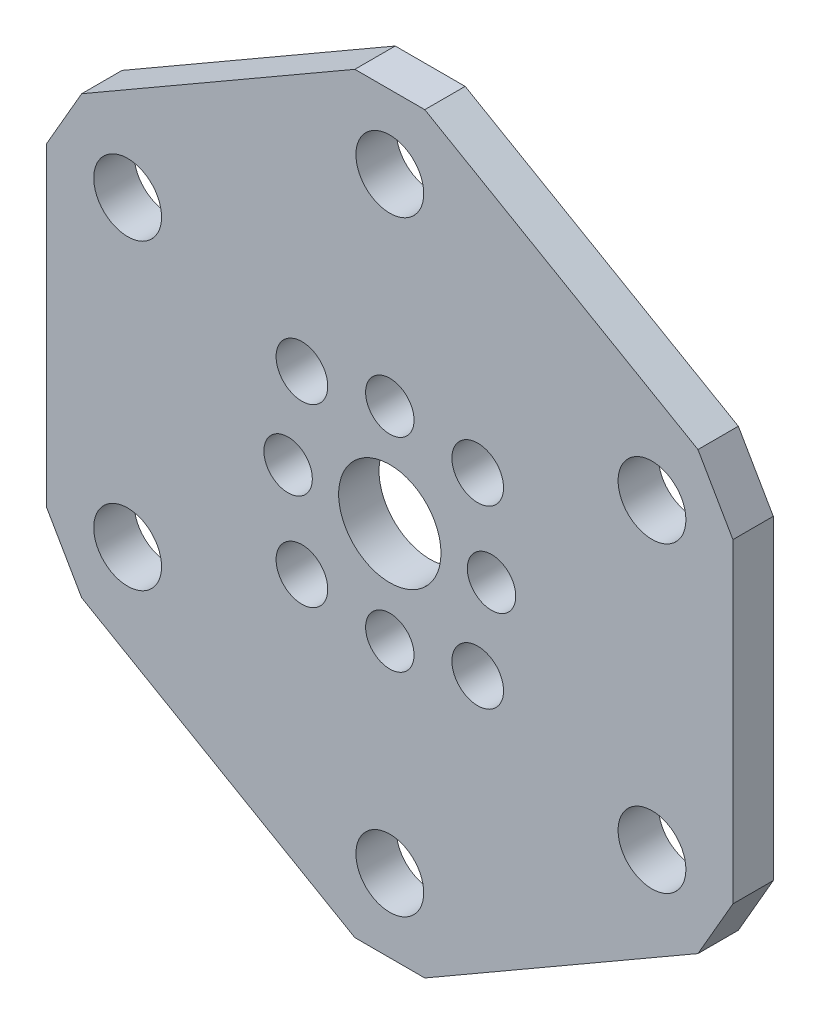
ISO-10303-21;
HEADER;
FILE_DESCRIPTION(('STEP AP214'),'2;1');
FILE_NAME('part.step','',(''),(''),'','','');
FILE_SCHEMA(('AUTOMOTIVE_DESIGN { 1 0 10303 214 1 1 1 1 }'));
ENDSEC;
DATA;
#1=APPLICATION_CONTEXT('core data for automotive mechanical design processes');
#2=APPLICATION_PROTOCOL_DEFINITION('international standard','automotive_design',2000,#1);
#3=PRODUCT_CONTEXT('',#1,'mechanical');
#4=PRODUCT('Part','Part','',(#3));
#5=PRODUCT_RELATED_PRODUCT_CATEGORY('part','',(#4));
#6=PRODUCT_DEFINITION_FORMATION('','',#4);
#7=PRODUCT_DEFINITION_CONTEXT('part definition',#1,'design');
#8=PRODUCT_DEFINITION('design','',#6,#7);
#9=PRODUCT_DEFINITION_SHAPE('','',#8);
#10=(LENGTH_UNIT() NAMED_UNIT(*) SI_UNIT(.MILLI.,.METRE.));
#11=(NAMED_UNIT(*) PLANE_ANGLE_UNIT() SI_UNIT($,.RADIAN.));
#12=(NAMED_UNIT(*) SI_UNIT($,.STERADIAN.) SOLID_ANGLE_UNIT());
#13=UNCERTAINTY_MEASURE_WITH_UNIT(LENGTH_MEASURE(1.E-05),#10,'distance_accuracy_value','');
#14=(GEOMETRIC_REPRESENTATION_CONTEXT(3) GLOBAL_UNCERTAINTY_ASSIGNED_CONTEXT((#13)) GLOBAL_UNIT_ASSIGNED_CONTEXT((#10,
#11,#12)) REPRESENTATION_CONTEXT('',''));
#15=CARTESIAN_POINT('',(0.,0.,0.));
#16=DIRECTION('',(0.,0.,1.));
#17=DIRECTION('',(1.,0.,0.));
#18=AXIS2_PLACEMENT_3D('',#15,#16,#17);
#19=CARTESIAN_POINT('',(-24.2378693429844,17.168740389755,3.175));
#20=DIRECTION('',(-0.5,0.866025403784439,0.));
#21=DIRECTION('',(-0.866025403784439,-0.5,0.));
#22=AXIS2_PLACEMENT_3D('',#19,#20,#21);
#23=PLANE('',#22);
#24=DIRECTION('',(0.866025403784439,0.5,0.));
#25=VECTOR('',#24,1.);
#26=CARTESIAN_POINT('',(-24.2378693429844,17.168740389755,0.));
#27=LINE('',#26,#25);
#28=CARTESIAN_POINT('',(-24.2378693429844,17.168740389755,0.));
#29=VERTEX_POINT('',#28);
#30=CARTESIAN_POINT('',(-2.74963065701559,29.5749807795101,0.));
#31=VERTEX_POINT('',#30);
#32=EDGE_CURVE('E154',#29,#31,#27,.T.);
#33=ORIENTED_EDGE('',*,*,#32,.F.);
#34=DIRECTION('',(0.,0.,-1.));
#35=VECTOR('',#34,1.);
#36=CARTESIAN_POINT('',(-24.2378693429844,17.168740389755,3.175));
#37=LINE('',#36,#35);
#38=CARTESIAN_POINT('',(-24.2378693429844,17.168740389755,3.175));
#39=VERTEX_POINT('',#38);
#40=EDGE_CURVE('E11',#39,#29,#37,.T.);
#41=ORIENTED_EDGE('',*,*,#40,.F.);
#42=DIRECTION('',(0.866025403784439,0.5,0.));
#43=VECTOR('',#42,1.);
#44=CARTESIAN_POINT('',(-24.2378693429844,17.168740389755,3.175));
#45=LINE('',#44,#43);
#46=CARTESIAN_POINT('',(-2.74963065701559,29.5749807795101,3.175));
#47=VERTEX_POINT('',#46);
#48=EDGE_CURVE('E187',#39,#47,#45,.T.);
#49=ORIENTED_EDGE('',*,*,#48,.T.);
#50=DIRECTION('',(0.,0.,-1.));
#51=VECTOR('',#50,1.);
#52=CARTESIAN_POINT('',(-2.74963065701559,29.5749807795101,3.175));
#53=LINE('',#52,#51);
#54=EDGE_CURVE('E36',#47,#31,#53,.T.);
#55=ORIENTED_EDGE('',*,*,#54,.T.);
#56=EDGE_LOOP('',(#33,#41,#49,#55));
#57=FACE_BOUND('',#56,.T.);
#58=ADVANCED_FACE('F33',(#57),#23,.T.);
#59=CARTESIAN_POINT('',(-26.9875,12.406240389755,3.175));
#60=DIRECTION('',(-0.866025403784438,0.5,0.));
#61=DIRECTION('',(-0.5,-0.866025403784439,0.));
#62=AXIS2_PLACEMENT_3D('',#59,#60,#61);
#63=PLANE('',#62);
#64=DIRECTION('',(0.5,0.866025403784439,0.));
#65=VECTOR('',#64,1.);
#66=CARTESIAN_POINT('',(-26.9875,12.406240389755,0.));
#67=LINE('',#66,#65);
#68=CARTESIAN_POINT('',(-26.9875,12.406240389755,0.));
#69=VERTEX_POINT('',#68);
#70=EDGE_CURVE('E185',#69,#29,#67,.T.);
#71=ORIENTED_EDGE('',*,*,#70,.F.);
#72=DIRECTION('',(0.,0.,-1.));
#73=VECTOR('',#72,1.);
#74=CARTESIAN_POINT('',(-26.9875,12.406240389755,3.175));
#75=LINE('',#74,#73);
#76=CARTESIAN_POINT('',(-26.9875,12.406240389755,3.175));
#77=VERTEX_POINT('',#76);
#78=EDGE_CURVE('E42',#77,#69,#75,.T.);
#79=ORIENTED_EDGE('',*,*,#78,.F.);
#80=DIRECTION('',(0.5,0.866025403784439,0.));
#81=VECTOR('',#80,1.);
#82=CARTESIAN_POINT('',(-26.9875,12.406240389755,3.175));
#83=LINE('',#82,#81);
#84=EDGE_CURVE('E144',#77,#39,#83,.T.);
#85=ORIENTED_EDGE('',*,*,#84,.T.);
#86=ORIENTED_EDGE('',*,*,#40,.T.);
#87=EDGE_LOOP('',(#71,#79,#85,#86));
#88=FACE_BOUND('',#87,.T.);
#89=ADVANCED_FACE('F207',(#88),#63,.T.);
#90=CARTESIAN_POINT('',(-26.9875,-12.406240389755,3.175));
#91=DIRECTION('',(-1.,0.,0.));
#92=DIRECTION('',(0.,-1.,0.));
#93=AXIS2_PLACEMENT_3D('',#90,#91,#92);
#94=PLANE('',#93);
#95=DIRECTION('',(0.,1.,0.));
#96=VECTOR('',#95,1.);
#97=CARTESIAN_POINT('',(-26.9875,-12.406240389755,0.));
#98=LINE('',#97,#96);
#99=CARTESIAN_POINT('',(-26.9875,-12.406240389755,0.));
#100=VERTEX_POINT('',#99);
#101=EDGE_CURVE('E131',#100,#69,#98,.T.);
#102=ORIENTED_EDGE('',*,*,#101,.F.);
#103=DIRECTION('',(0.,0.,-1.));
#104=VECTOR('',#103,1.);
#105=CARTESIAN_POINT('',(-26.9875,-12.406240389755,3.175));
#106=LINE('',#105,#104);
#107=CARTESIAN_POINT('',(-26.9875,-12.406240389755,3.175));
#108=VERTEX_POINT('',#107);
#109=EDGE_CURVE('E126',#108,#100,#106,.T.);
#110=ORIENTED_EDGE('',*,*,#109,.F.);
#111=DIRECTION('',(0.,1.,0.));
#112=VECTOR('',#111,1.);
#113=CARTESIAN_POINT('',(-26.9875,-12.406240389755,3.175));
#114=LINE('',#113,#112);
#115=EDGE_CURVE('E129',#108,#77,#114,.T.);
#116=ORIENTED_EDGE('',*,*,#115,.T.);
#117=ORIENTED_EDGE('',*,*,#78,.T.);
#118=EDGE_LOOP('',(#102,#110,#116,#117));
#119=FACE_BOUND('',#118,.T.);
#120=ADVANCED_FACE('F128',(#119),#94,.T.);
#121=CARTESIAN_POINT('',(-24.2378693429844,-17.168740389755,3.175));
#122=DIRECTION('',(-0.866025403784439,-0.5,0.));
#123=DIRECTION('',(0.5,-0.866025403784439,0.));
#124=AXIS2_PLACEMENT_3D('',#121,#122,#123);
#125=PLANE('',#124);
#126=DIRECTION('',(-0.5,0.866025403784439,0.));
#127=VECTOR('',#126,1.);
#128=CARTESIAN_POINT('',(-24.2378693429844,-17.168740389755,0.));
#129=LINE('',#128,#127);
#130=CARTESIAN_POINT('',(-24.2378693429844,-17.168740389755,0.));
#131=VERTEX_POINT('',#130);
#132=EDGE_CURVE('E182',#131,#100,#129,.T.);
#133=ORIENTED_EDGE('',*,*,#132,.F.);
#134=DIRECTION('',(0.,0.,-1.));
#135=VECTOR('',#134,1.);
#136=CARTESIAN_POINT('',(-24.2378693429844,-17.168740389755,3.175));
#137=LINE('',#136,#135);
#138=CARTESIAN_POINT('',(-24.2378693429844,-17.168740389755,3.175));
#139=VERTEX_POINT('',#138);
#140=EDGE_CURVE('E136',#139,#131,#137,.T.);
#141=ORIENTED_EDGE('',*,*,#140,.F.);
#142=DIRECTION('',(-0.5,0.866025403784439,0.));
#143=VECTOR('',#142,1.);
#144=CARTESIAN_POINT('',(-24.2378693429844,-17.168740389755,3.175));
#145=LINE('',#144,#143);
#146=EDGE_CURVE('E142',#139,#108,#145,.T.);
#147=ORIENTED_EDGE('',*,*,#146,.T.);
#148=ORIENTED_EDGE('',*,*,#109,.T.);
#149=EDGE_LOOP('',(#133,#141,#147,#148));
#150=FACE_BOUND('',#149,.T.);
#151=ADVANCED_FACE('F146',(#150),#125,.T.);
#152=CARTESIAN_POINT('',(-2.7496306570156,-29.57498077951,3.175));
#153=DIRECTION('',(-0.5,-0.866025403784439,0.));
#154=DIRECTION('',(0.866025403784439,-0.5,0.));
#155=AXIS2_PLACEMENT_3D('',#152,#153,#154);
#156=PLANE('',#155);
#157=DIRECTION('',(-0.866025403784438,0.5,0.));
#158=VECTOR('',#157,1.);
#159=CARTESIAN_POINT('',(-2.7496306570156,-29.57498077951,0.));
#160=LINE('',#159,#158);
#161=CARTESIAN_POINT('',(-2.7496306570156,-29.57498077951,0.));
#162=VERTEX_POINT('',#161);
#163=EDGE_CURVE('E179',#162,#131,#160,.T.);
#164=ORIENTED_EDGE('',*,*,#163,.F.);
#165=DIRECTION('',(0.,0.,-1.));
#166=VECTOR('',#165,1.);
#167=CARTESIAN_POINT('',(-2.7496306570156,-29.57498077951,3.175));
#168=LINE('',#167,#166);
#169=CARTESIAN_POINT('',(-2.7496306570156,-29.57498077951,3.175));
#170=VERTEX_POINT('',#169);
#171=EDGE_CURVE('E191',#170,#162,#168,.T.);
#172=ORIENTED_EDGE('',*,*,#171,.F.);
#173=DIRECTION('',(-0.866025403784438,0.5,0.));
#174=VECTOR('',#173,1.);
#175=CARTESIAN_POINT('',(-2.7496306570156,-29.57498077951,3.175));
#176=LINE('',#175,#174);
#177=EDGE_CURVE('E147',#170,#139,#176,.T.);
#178=ORIENTED_EDGE('',*,*,#177,.T.);
#179=ORIENTED_EDGE('',*,*,#140,.T.);
#180=EDGE_LOOP('',(#164,#172,#178,#179));
#181=FACE_BOUND('',#180,.T.);
#182=ADVANCED_FACE('F220',(#181),#156,.T.);
#183=CARTESIAN_POINT('',(2.74963065701558,-29.57498077951,3.175));
#184=DIRECTION('',(0.,-1.,0.));
#185=DIRECTION('',(0.,0.,-1.));
#186=AXIS2_PLACEMENT_3D('',#183,#184,#185);
#187=PLANE('',#186);
#188=DIRECTION('',(-1.,0.,0.));
#189=VECTOR('',#188,1.);
#190=CARTESIAN_POINT('',(2.74963065701558,-29.57498077951,0.));
#191=LINE('',#190,#189);
#192=CARTESIAN_POINT('',(2.74963065701558,-29.57498077951,0.));
#193=VERTEX_POINT('',#192);
#194=EDGE_CURVE('E176',#193,#162,#191,.T.);
#195=ORIENTED_EDGE('',*,*,#194,.F.);
#196=DIRECTION('',(0.,0.,-1.));
#197=VECTOR('',#196,1.);
#198=CARTESIAN_POINT('',(2.74963065701558,-29.57498077951,3.175));
#199=LINE('',#198,#197);
#200=CARTESIAN_POINT('',(2.74963065701558,-29.57498077951,3.175));
#201=VERTEX_POINT('',#200);
#202=EDGE_CURVE('E193',#201,#193,#199,.T.);
#203=ORIENTED_EDGE('',*,*,#202,.F.);
#204=DIRECTION('',(-1.,0.,0.));
#205=VECTOR('',#204,1.);
#206=CARTESIAN_POINT('',(2.74963065701558,-29.57498077951,3.175));
#207=LINE('',#206,#205);
#208=EDGE_CURVE('E149',#201,#170,#207,.T.);
#209=ORIENTED_EDGE('',*,*,#208,.T.);
#210=ORIENTED_EDGE('',*,*,#171,.T.);
#211=EDGE_LOOP('',(#195,#203,#209,#210));
#212=FACE_BOUND('',#211,.T.);
#213=ADVANCED_FACE('F223',(#212),#187,.T.);
#214=CARTESIAN_POINT('',(24.2378693429844,-17.168740389755,3.175));
#215=DIRECTION('',(0.5,-0.866025403784439,0.));
#216=DIRECTION('',(0.866025403784439,0.5,0.));
#217=AXIS2_PLACEMENT_3D('',#214,#215,#216);
#218=PLANE('',#217);
#219=DIRECTION('',(-0.866025403784439,-0.5,0.));
#220=VECTOR('',#219,1.);
#221=CARTESIAN_POINT('',(24.2378693429844,-17.168740389755,0.));
#222=LINE('',#221,#220);
#223=CARTESIAN_POINT('',(24.2378693429844,-17.168740389755,0.));
#224=VERTEX_POINT('',#223);
#225=EDGE_CURVE('E173',#224,#193,#222,.T.);
#226=ORIENTED_EDGE('',*,*,#225,.F.);
#227=DIRECTION('',(0.,0.,-1.));
#228=VECTOR('',#227,1.);
#229=CARTESIAN_POINT('',(24.2378693429844,-17.168740389755,3.175));
#230=LINE('',#229,#228);
#231=CARTESIAN_POINT('',(24.2378693429844,-17.168740389755,3.175));
#232=VERTEX_POINT('',#231);
#233=EDGE_CURVE('E195',#232,#224,#230,.T.);
#234=ORIENTED_EDGE('',*,*,#233,.F.);
#235=DIRECTION('',(-0.866025403784439,-0.5,0.));
#236=VECTOR('',#235,1.);
#237=CARTESIAN_POINT('',(24.2378693429844,-17.168740389755,3.175));
#238=LINE('',#237,#236);
#239=EDGE_CURVE('E427',#232,#201,#238,.T.);
#240=ORIENTED_EDGE('',*,*,#239,.T.);
#241=ORIENTED_EDGE('',*,*,#202,.T.);
#242=EDGE_LOOP('',(#226,#234,#240,#241));
#243=FACE_BOUND('',#242,.T.);
#244=ADVANCED_FACE('F227',(#243),#218,.T.);
#245=CARTESIAN_POINT('',(26.9875,-12.406240389755,3.175));
#246=DIRECTION('',(0.866025403784438,-0.5,0.));
#247=DIRECTION('',(0.5,0.866025403784439,0.));
#248=AXIS2_PLACEMENT_3D('',#245,#246,#247);
#249=PLANE('',#248);
#250=DIRECTION('',(-0.5,-0.866025403784438,0.));
#251=VECTOR('',#250,1.);
#252=CARTESIAN_POINT('',(26.9875,-12.406240389755,0.));
#253=LINE('',#252,#251);
#254=CARTESIAN_POINT('',(26.9875,-12.406240389755,0.));
#255=VERTEX_POINT('',#254);
#256=EDGE_CURVE('E170',#255,#224,#253,.T.);
#257=ORIENTED_EDGE('',*,*,#256,.F.);
#258=DIRECTION('',(0.,0.,-1.));
#259=VECTOR('',#258,1.);
#260=CARTESIAN_POINT('',(26.9875,-12.406240389755,3.175));
#261=LINE('',#260,#259);
#262=CARTESIAN_POINT('',(26.9875,-12.406240389755,3.175));
#263=VERTEX_POINT('',#262);
#264=EDGE_CURVE('E197',#263,#255,#261,.T.);
#265=ORIENTED_EDGE('',*,*,#264,.F.);
#266=DIRECTION('',(-0.5,-0.866025403784438,0.));
#267=VECTOR('',#266,1.);
#268=CARTESIAN_POINT('',(26.9875,-12.406240389755,3.175));
#269=LINE('',#268,#267);
#270=EDGE_CURVE('E424',#263,#232,#269,.T.);
#271=ORIENTED_EDGE('',*,*,#270,.T.);
#272=ORIENTED_EDGE('',*,*,#233,.T.);
#273=EDGE_LOOP('',(#257,#265,#271,#272));
#274=FACE_BOUND('',#273,.T.);
#275=ADVANCED_FACE('F231',(#274),#249,.T.);
#276=CARTESIAN_POINT('',(26.9875,12.406240389755,3.175));
#277=DIRECTION('',(1.,0.,0.));
#278=DIRECTION('',(0.,1.,0.));
#279=AXIS2_PLACEMENT_3D('',#276,#277,#278);
#280=PLANE('',#279);
#281=DIRECTION('',(0.,-1.,0.));
#282=VECTOR('',#281,1.);
#283=CARTESIAN_POINT('',(26.9875,12.406240389755,0.));
#284=LINE('',#283,#282);
#285=CARTESIAN_POINT('',(26.9875,12.406240389755,0.));
#286=VERTEX_POINT('',#285);
#287=EDGE_CURVE('E167',#286,#255,#284,.T.);
#288=ORIENTED_EDGE('',*,*,#287,.F.);
#289=DIRECTION('',(0.,0.,-1.));
#290=VECTOR('',#289,1.);
#291=CARTESIAN_POINT('',(26.9875,12.406240389755,3.175));
#292=LINE('',#291,#290);
#293=CARTESIAN_POINT('',(26.9875,12.406240389755,3.175));
#294=VERTEX_POINT('',#293);
#295=EDGE_CURVE('E199',#294,#286,#292,.T.);
#296=ORIENTED_EDGE('',*,*,#295,.F.);
#297=DIRECTION('',(0.,-1.,0.));
#298=VECTOR('',#297,1.);
#299=CARTESIAN_POINT('',(26.9875,12.406240389755,3.175));
#300=LINE('',#299,#298);
#301=EDGE_CURVE('E421',#294,#263,#300,.T.);
#302=ORIENTED_EDGE('',*,*,#301,.T.);
#303=ORIENTED_EDGE('',*,*,#264,.T.);
#304=EDGE_LOOP('',(#288,#296,#302,#303));
#305=FACE_BOUND('',#304,.T.);
#306=ADVANCED_FACE('F235',(#305),#280,.T.);
#307=CARTESIAN_POINT('',(24.2378693429844,17.168740389755,3.175));
#308=DIRECTION('',(0.866025403784439,0.5,0.));
#309=DIRECTION('',(-0.5,0.866025403784439,0.));
#310=AXIS2_PLACEMENT_3D('',#307,#308,#309);
#311=PLANE('',#310);
#312=DIRECTION('',(0.5,-0.866025403784439,0.));
#313=VECTOR('',#312,1.);
#314=CARTESIAN_POINT('',(24.2378693429844,17.168740389755,0.));
#315=LINE('',#314,#313);
#316=CARTESIAN_POINT('',(24.2378693429844,17.168740389755,0.));
#317=VERTEX_POINT('',#316);
#318=EDGE_CURVE('E164',#317,#286,#315,.T.);
#319=ORIENTED_EDGE('',*,*,#318,.F.);
#320=DIRECTION('',(0.,0.,-1.));
#321=VECTOR('',#320,1.);
#322=CARTESIAN_POINT('',(24.2378693429844,17.168740389755,3.175));
#323=LINE('',#322,#321);
#324=CARTESIAN_POINT('',(24.2378693429844,17.168740389755,3.175));
#325=VERTEX_POINT('',#324);
#326=EDGE_CURVE('E201',#325,#317,#323,.T.);
#327=ORIENTED_EDGE('',*,*,#326,.F.);
#328=DIRECTION('',(0.5,-0.866025403784439,0.));
#329=VECTOR('',#328,1.);
#330=CARTESIAN_POINT('',(24.2378693429844,17.168740389755,3.175));
#331=LINE('',#330,#329);
#332=EDGE_CURVE('E418',#325,#294,#331,.T.);
#333=ORIENTED_EDGE('',*,*,#332,.T.);
#334=ORIENTED_EDGE('',*,*,#295,.T.);
#335=EDGE_LOOP('',(#319,#327,#333,#334));
#336=FACE_BOUND('',#335,.T.);
#337=ADVANCED_FACE('F239',(#336),#311,.T.);
#338=CARTESIAN_POINT('',(2.74963065701559,29.5749807795101,3.175));
#339=DIRECTION('',(0.5,0.866025403784438,0.));
#340=DIRECTION('',(-0.866025403784439,0.5,0.));
#341=AXIS2_PLACEMENT_3D('',#338,#339,#340);
#342=PLANE('',#341);
#343=DIRECTION('',(0.866025403784438,-0.5,0.));
#344=VECTOR('',#343,1.);
#345=CARTESIAN_POINT('',(2.74963065701559,29.5749807795101,0.));
#346=LINE('',#345,#344);
#347=CARTESIAN_POINT('',(2.74963065701559,29.5749807795101,0.));
#348=VERTEX_POINT('',#347);
#349=EDGE_CURVE('E161',#348,#317,#346,.T.);
#350=ORIENTED_EDGE('',*,*,#349,.F.);
#351=DIRECTION('',(0.,0.,-1.));
#352=VECTOR('',#351,1.);
#353=CARTESIAN_POINT('',(2.74963065701559,29.5749807795101,3.175));
#354=LINE('',#353,#352);
#355=CARTESIAN_POINT('',(2.74963065701559,29.5749807795101,3.175));
#356=VERTEX_POINT('',#355);
#357=EDGE_CURVE('E202',#356,#348,#354,.T.);
#358=ORIENTED_EDGE('',*,*,#357,.F.);
#359=DIRECTION('',(0.866025403784438,-0.5,0.));
#360=VECTOR('',#359,1.);
#361=CARTESIAN_POINT('',(2.74963065701559,29.5749807795101,3.175));
#362=LINE('',#361,#360);
#363=EDGE_CURVE('E415',#356,#325,#362,.T.);
#364=ORIENTED_EDGE('',*,*,#363,.T.);
#365=ORIENTED_EDGE('',*,*,#326,.T.);
#366=EDGE_LOOP('',(#350,#358,#364,#365));
#367=FACE_BOUND('',#366,.T.);
#368=ADVANCED_FACE('F243',(#367),#342,.T.);
#369=CARTESIAN_POINT('',(-2.74963065701559,29.5749807795101,3.175));
#370=DIRECTION('',(0.,1.,0.));
#371=DIRECTION('',(0.,0.,1.));
#372=AXIS2_PLACEMENT_3D('',#369,#370,#371);
#373=PLANE('',#372);
#374=DIRECTION('',(1.,0.,0.));
#375=VECTOR('',#374,1.);
#376=CARTESIAN_POINT('',(-2.74963065701559,29.5749807795101,0.));
#377=LINE('',#376,#375);
#378=EDGE_CURVE('E157',#31,#348,#377,.T.);
#379=ORIENTED_EDGE('',*,*,#378,.F.);
#380=ORIENTED_EDGE('',*,*,#54,.F.);
#381=DIRECTION('',(1.,0.,0.));
#382=VECTOR('',#381,1.);
#383=CARTESIAN_POINT('',(-2.74963065701559,29.5749807795101,3.175));
#384=LINE('',#383,#382);
#385=EDGE_CURVE('E413',#47,#356,#384,.T.);
#386=ORIENTED_EDGE('',*,*,#385,.T.);
#387=ORIENTED_EDGE('',*,*,#357,.T.);
#388=EDGE_LOOP('',(#379,#380,#386,#387));
#389=FACE_BOUND('',#388,.T.);
#390=ADVANCED_FACE('F204',(#389),#373,.T.);
#391=CARTESIAN_POINT('',(0.,0.,3.175));
#392=DIRECTION('',(0.,0.,-1.));
#393=DIRECTION('',(-1.,0.,0.));
#394=AXIS2_PLACEMENT_3D('',#391,#392,#393);
#395=PLANE('',#394);
#396=CARTESIAN_POINT('',(-6.91479721322323,6.91479721322326,3.175));
#397=DIRECTION('',(0.,0.,-1.));
#398=DIRECTION('',(1.,0.,0.));
#399=AXIS2_PLACEMENT_3D('',#396,#397,#398);
#400=CIRCLE('',#399,2.03200000000004);
#401=CARTESIAN_POINT('',(-4.88279721322319,6.91479721322326,3.175));
#402=VERTEX_POINT('',#401);
#403=EDGE_CURVE('E322',#402,#402,#400,.T.);
#404=ORIENTED_EDGE('',*,*,#403,.T.);
#405=EDGE_LOOP('',(#404));
#406=FACE_BOUND('',#405,.T.);
#407=CARTESIAN_POINT('',(-6.91479721322326,-6.91479721322323,3.175));
#408=DIRECTION('',(0.,0.,-1.));
#409=DIRECTION('',(1.,0.,0.));
#410=AXIS2_PLACEMENT_3D('',#407,#408,#409);
#411=CIRCLE('',#410,2.03200000000003);
#412=CARTESIAN_POINT('',(-4.88279721322323,-6.91479721322323,3.175));
#413=VERTEX_POINT('',#412);
#414=EDGE_CURVE('E330',#413,#413,#411,.T.);
#415=ORIENTED_EDGE('',*,*,#414,.T.);
#416=EDGE_LOOP('',(#415));
#417=FACE_BOUND('',#416,.T.);
#418=CARTESIAN_POINT('',(6.91479721322321,-6.91479721322328,3.175));
#419=DIRECTION('',(0.,0.,-1.));
#420=DIRECTION('',(1.,0.,0.));
#421=AXIS2_PLACEMENT_3D('',#418,#419,#420);
#422=CIRCLE('',#421,2.032);
#423=CARTESIAN_POINT('',(8.94679721322321,-6.91479721322328,3.175));
#424=VERTEX_POINT('',#423);
#425=EDGE_CURVE('E336',#424,#424,#422,.T.);
#426=ORIENTED_EDGE('',*,*,#425,.T.);
#427=EDGE_LOOP('',(#426));
#428=FACE_BOUND('',#427,.T.);
#429=CARTESIAN_POINT('',(6.91479721322326,6.91479721322323,3.175));
#430=DIRECTION('',(0.,0.,-1.));
#431=DIRECTION('',(1.,0.,0.));
#432=AXIS2_PLACEMENT_3D('',#429,#430,#431);
#433=CIRCLE('',#432,2.032);
#434=CARTESIAN_POINT('',(8.94679721322326,6.91479721322323,3.175));
#435=VERTEX_POINT('',#434);
#436=EDGE_CURVE('E342',#435,#435,#433,.T.);
#437=ORIENTED_EDGE('',*,*,#436,.T.);
#438=EDGE_LOOP('',(#437));
#439=FACE_BOUND('',#438,.T.);
#440=CARTESIAN_POINT('',(-20.6222299276169,-11.90625,3.175));
#441=DIRECTION('',(0.,0.,-1.));
#442=DIRECTION('',(1.,0.,0.));
#443=AXIS2_PLACEMENT_3D('',#440,#441,#442);
#444=CIRCLE('',#443,2.66700000000022);
#445=CARTESIAN_POINT('',(-17.9552299276167,-11.90625,3.175));
#446=VERTEX_POINT('',#445);
#447=EDGE_CURVE('E348',#446,#446,#444,.T.);
#448=ORIENTED_EDGE('',*,*,#447,.T.);
#449=EDGE_LOOP('',(#448));
#450=FACE_BOUND('',#449,.T.);
#451=CARTESIAN_POINT('',(20.6222299276169,-11.9062500000001,3.175));
#452=DIRECTION('',(0.,0.,-1.));
#453=DIRECTION('',(1.,0.,0.));
#454=AXIS2_PLACEMENT_3D('',#451,#452,#453);
#455=CIRCLE('',#454,2.667);
#456=CARTESIAN_POINT('',(23.2892299276169,-11.9062500000001,3.175));
#457=VERTEX_POINT('',#456);
#458=EDGE_CURVE('E354',#457,#457,#455,.T.);
#459=ORIENTED_EDGE('',*,*,#458,.T.);
#460=EDGE_LOOP('',(#459));
#461=FACE_BOUND('',#460,.T.);
#462=CARTESIAN_POINT('',(-8.,0.,3.175));
#463=DIRECTION('',(0.,0.,-1.));
#464=DIRECTION('',(1.,0.,0.));
#465=AXIS2_PLACEMENT_3D('',#462,#463,#464);
#466=CIRCLE('',#465,1.90500000000008);
#467=CARTESIAN_POINT('',(-6.09499999999992,0.,3.175));
#468=VERTEX_POINT('',#467);
#469=EDGE_CURVE('E360',#468,#468,#466,.T.);
#470=ORIENTED_EDGE('',*,*,#469,.T.);
#471=EDGE_LOOP('',(#470));
#472=FACE_BOUND('',#471,.T.);
#473=CARTESIAN_POINT('',(8.,0.,3.175));
#474=DIRECTION('',(0.,0.,-1.));
#475=DIRECTION('',(1.,0.,0.));
#476=AXIS2_PLACEMENT_3D('',#473,#474,#475);
#477=CIRCLE('',#476,1.905);
#478=CARTESIAN_POINT('',(9.905,0.,3.175));
#479=VERTEX_POINT('',#478);
#480=EDGE_CURVE('E366',#479,#479,#477,.T.);
#481=ORIENTED_EDGE('',*,*,#480,.T.);
#482=EDGE_LOOP('',(#481));
#483=FACE_BOUND('',#482,.T.);
#484=CARTESIAN_POINT('',(0.,0.,3.175));
#485=DIRECTION('',(0.,0.,-1.));
#486=DIRECTION('',(1.,0.,0.));
#487=AXIS2_PLACEMENT_3D('',#484,#485,#486);
#488=CIRCLE('',#487,4.025);
#489=CARTESIAN_POINT('',(4.025,0.,3.175));
#490=VERTEX_POINT('',#489);
#491=EDGE_CURVE('E372',#490,#490,#488,.T.);
#492=ORIENTED_EDGE('',*,*,#491,.T.);
#493=EDGE_LOOP('',(#492));
#494=FACE_BOUND('',#493,.T.);
#495=CARTESIAN_POINT('',(0.,23.8125,3.175));
#496=DIRECTION('',(0.,0.,-1.));
#497=DIRECTION('',(1.,0.,0.));
#498=AXIS2_PLACEMENT_3D('',#495,#496,#497);
#499=CIRCLE('',#498,2.66699999999999);
#500=CARTESIAN_POINT('',(2.667,23.8125,3.175));
#501=VERTEX_POINT('',#500);
#502=EDGE_CURVE('E378',#501,#501,#499,.T.);
#503=ORIENTED_EDGE('',*,*,#502,.T.);
#504=EDGE_LOOP('',(#503));
#505=FACE_BOUND('',#504,.T.);
#506=CARTESIAN_POINT('',(0.,8.,3.175));
#507=DIRECTION('',(0.,0.,-1.));
#508=DIRECTION('',(1.,0.,0.));
#509=AXIS2_PLACEMENT_3D('',#506,#507,#508);
#510=CIRCLE('',#509,1.905);
#511=CARTESIAN_POINT('',(1.905,8.,3.175));
#512=VERTEX_POINT('',#511);
#513=EDGE_CURVE('E384',#512,#512,#510,.T.);
#514=ORIENTED_EDGE('',*,*,#513,.T.);
#515=EDGE_LOOP('',(#514));
#516=FACE_BOUND('',#515,.T.);
#517=CARTESIAN_POINT('',(0.,-8.,3.175));
#518=DIRECTION('',(0.,0.,-1.));
#519=DIRECTION('',(1.,0.,0.));
#520=AXIS2_PLACEMENT_3D('',#517,#518,#519);
#521=CIRCLE('',#520,1.90500000000005);
#522=CARTESIAN_POINT('',(1.90500000000005,-8.,3.175));
#523=VERTEX_POINT('',#522);
#524=EDGE_CURVE('E390',#523,#523,#521,.T.);
#525=ORIENTED_EDGE('',*,*,#524,.T.);
#526=EDGE_LOOP('',(#525));
#527=FACE_BOUND('',#526,.T.);
#528=CARTESIAN_POINT('',(20.622229927617,11.90625,3.175));
#529=DIRECTION('',(0.,0.,-1.));
#530=DIRECTION('',(1.,0.,0.));
#531=AXIS2_PLACEMENT_3D('',#528,#529,#530);
#532=CIRCLE('',#531,2.667);
#533=CARTESIAN_POINT('',(23.289229927617,11.90625,3.175));
#534=VERTEX_POINT('',#533);
#535=EDGE_CURVE('E396',#534,#534,#532,.T.);
#536=ORIENTED_EDGE('',*,*,#535,.T.);
#537=EDGE_LOOP('',(#536));
#538=FACE_BOUND('',#537,.T.);
#539=CARTESIAN_POINT('',(0.,-23.8125,3.175));
#540=DIRECTION('',(0.,0.,-1.));
#541=DIRECTION('',(1.,0.,0.));
#542=AXIS2_PLACEMENT_3D('',#539,#540,#541);
#543=CIRCLE('',#542,2.66700000000016);
#544=CARTESIAN_POINT('',(2.66700000000015,-23.8125,3.175));
#545=VERTEX_POINT('',#544);
#546=EDGE_CURVE('E402',#545,#545,#543,.T.);
#547=ORIENTED_EDGE('',*,*,#546,.T.);
#548=EDGE_LOOP('',(#547));
#549=FACE_BOUND('',#548,.T.);
#550=CARTESIAN_POINT('',(-20.6222299276168,11.9062500000002,3.175));
#551=DIRECTION('',(0.,0.,-1.));
#552=DIRECTION('',(1.,0.,0.));
#553=AXIS2_PLACEMENT_3D('',#550,#551,#552);
#554=CIRCLE('',#553,2.667);
#555=CARTESIAN_POINT('',(-17.9552299276168,11.9062500000002,3.175));
#556=VERTEX_POINT('',#555);
#557=EDGE_CURVE('E158',#556,#556,#554,.T.);
#558=ORIENTED_EDGE('',*,*,#557,.T.);
#559=EDGE_LOOP('',(#558));
#560=FACE_BOUND('',#559,.T.);
#561=ORIENTED_EDGE('',*,*,#48,.F.);
#562=ORIENTED_EDGE('',*,*,#84,.F.);
#563=ORIENTED_EDGE('',*,*,#115,.F.);
#564=ORIENTED_EDGE('',*,*,#146,.F.);
#565=ORIENTED_EDGE('',*,*,#177,.F.);
#566=ORIENTED_EDGE('',*,*,#208,.F.);
#567=ORIENTED_EDGE('',*,*,#239,.F.);
#568=ORIENTED_EDGE('',*,*,#270,.F.);
#569=ORIENTED_EDGE('',*,*,#301,.F.);
#570=ORIENTED_EDGE('',*,*,#332,.F.);
#571=ORIENTED_EDGE('',*,*,#363,.F.);
#572=ORIENTED_EDGE('',*,*,#385,.F.);
#573=EDGE_LOOP('',(#561,#562,#563,#564,#565,#566,#567,#568,#569,#570,#571,#572));
#574=FACE_BOUND('',#573,.T.);
#575=ADVANCED_FACE('F140',(#406,#417,#428,#439,#450,#461,#472,#483,#494,#505,#516,#527,#538,
#549,#560,#574),#395,.F.);
#576=CARTESIAN_POINT('',(0.,0.,0.));
#577=DIRECTION('',(0.,0.,-1.));
#578=DIRECTION('',(-1.,0.,0.));
#579=AXIS2_PLACEMENT_3D('',#576,#577,#578);
#580=PLANE('',#579);
#581=CARTESIAN_POINT('',(-6.91479721322323,6.91479721322326,0.));
#582=DIRECTION('',(0.,0.,-1.));
#583=DIRECTION('',(1.,0.,0.));
#584=AXIS2_PLACEMENT_3D('',#581,#582,#583);
#585=CIRCLE('',#584,2.03200000000004);
#586=CARTESIAN_POINT('',(-4.88279721322319,6.91479721322326,0.));
#587=VERTEX_POINT('',#586);
#588=EDGE_CURVE('E325',#587,#587,#585,.T.);
#589=ORIENTED_EDGE('',*,*,#588,.F.);
#590=EDGE_LOOP('',(#589));
#591=FACE_BOUND('',#590,.T.);
#592=CARTESIAN_POINT('',(-6.91479721322326,-6.91479721322323,0.));
#593=DIRECTION('',(0.,0.,-1.));
#594=DIRECTION('',(1.,0.,0.));
#595=AXIS2_PLACEMENT_3D('',#592,#593,#594);
#596=CIRCLE('',#595,2.03200000000003);
#597=CARTESIAN_POINT('',(-4.88279721322323,-6.91479721322323,0.));
#598=VERTEX_POINT('',#597);
#599=EDGE_CURVE('E327',#598,#598,#596,.T.);
#600=ORIENTED_EDGE('',*,*,#599,.F.);
#601=EDGE_LOOP('',(#600));
#602=FACE_BOUND('',#601,.T.);
#603=CARTESIAN_POINT('',(6.91479721322321,-6.91479721322328,0.));
#604=DIRECTION('',(0.,0.,-1.));
#605=DIRECTION('',(1.,0.,0.));
#606=AXIS2_PLACEMENT_3D('',#603,#604,#605);
#607=CIRCLE('',#606,2.032);
#608=CARTESIAN_POINT('',(8.94679721322321,-6.91479721322328,0.));
#609=VERTEX_POINT('',#608);
#610=EDGE_CURVE('E333',#609,#609,#607,.T.);
#611=ORIENTED_EDGE('',*,*,#610,.F.);
#612=EDGE_LOOP('',(#611));
#613=FACE_BOUND('',#612,.T.);
#614=CARTESIAN_POINT('',(6.91479721322326,6.91479721322323,0.));
#615=DIRECTION('',(0.,0.,-1.));
#616=DIRECTION('',(1.,0.,0.));
#617=AXIS2_PLACEMENT_3D('',#614,#615,#616);
#618=CIRCLE('',#617,2.032);
#619=CARTESIAN_POINT('',(8.94679721322326,6.91479721322323,0.));
#620=VERTEX_POINT('',#619);
#621=EDGE_CURVE('E339',#620,#620,#618,.T.);
#622=ORIENTED_EDGE('',*,*,#621,.F.);
#623=EDGE_LOOP('',(#622));
#624=FACE_BOUND('',#623,.T.);
#625=CARTESIAN_POINT('',(-20.6222299276169,-11.90625,0.));
#626=DIRECTION('',(0.,0.,-1.));
#627=DIRECTION('',(1.,0.,0.));
#628=AXIS2_PLACEMENT_3D('',#625,#626,#627);
#629=CIRCLE('',#628,2.66700000000022);
#630=CARTESIAN_POINT('',(-17.9552299276167,-11.90625,0.));
#631=VERTEX_POINT('',#630);
#632=EDGE_CURVE('E345',#631,#631,#629,.T.);
#633=ORIENTED_EDGE('',*,*,#632,.F.);
#634=EDGE_LOOP('',(#633));
#635=FACE_BOUND('',#634,.T.);
#636=CARTESIAN_POINT('',(20.6222299276169,-11.9062500000001,0.));
#637=DIRECTION('',(0.,0.,-1.));
#638=DIRECTION('',(1.,0.,0.));
#639=AXIS2_PLACEMENT_3D('',#636,#637,#638);
#640=CIRCLE('',#639,2.667);
#641=CARTESIAN_POINT('',(23.2892299276169,-11.9062500000001,0.));
#642=VERTEX_POINT('',#641);
#643=EDGE_CURVE('E351',#642,#642,#640,.T.);
#644=ORIENTED_EDGE('',*,*,#643,.F.);
#645=EDGE_LOOP('',(#644));
#646=FACE_BOUND('',#645,.T.);
#647=CARTESIAN_POINT('',(-8.,0.,0.));
#648=DIRECTION('',(0.,0.,-1.));
#649=DIRECTION('',(1.,0.,0.));
#650=AXIS2_PLACEMENT_3D('',#647,#648,#649);
#651=CIRCLE('',#650,1.90500000000008);
#652=CARTESIAN_POINT('',(-6.09499999999992,0.,0.));
#653=VERTEX_POINT('',#652);
#654=EDGE_CURVE('E357',#653,#653,#651,.T.);
#655=ORIENTED_EDGE('',*,*,#654,.F.);
#656=EDGE_LOOP('',(#655));
#657=FACE_BOUND('',#656,.T.);
#658=CARTESIAN_POINT('',(8.,0.,0.));
#659=DIRECTION('',(0.,0.,-1.));
#660=DIRECTION('',(1.,0.,0.));
#661=AXIS2_PLACEMENT_3D('',#658,#659,#660);
#662=CIRCLE('',#661,1.905);
#663=CARTESIAN_POINT('',(9.905,0.,0.));
#664=VERTEX_POINT('',#663);
#665=EDGE_CURVE('E363',#664,#664,#662,.T.);
#666=ORIENTED_EDGE('',*,*,#665,.F.);
#667=EDGE_LOOP('',(#666));
#668=FACE_BOUND('',#667,.T.);
#669=CARTESIAN_POINT('',(0.,0.,0.));
#670=DIRECTION('',(0.,0.,-1.));
#671=DIRECTION('',(1.,0.,0.));
#672=AXIS2_PLACEMENT_3D('',#669,#670,#671);
#673=CIRCLE('',#672,4.025);
#674=CARTESIAN_POINT('',(4.025,0.,0.));
#675=VERTEX_POINT('',#674);
#676=EDGE_CURVE('E369',#675,#675,#673,.T.);
#677=ORIENTED_EDGE('',*,*,#676,.F.);
#678=EDGE_LOOP('',(#677));
#679=FACE_BOUND('',#678,.T.);
#680=CARTESIAN_POINT('',(0.,23.8125,0.));
#681=DIRECTION('',(0.,0.,-1.));
#682=DIRECTION('',(1.,0.,0.));
#683=AXIS2_PLACEMENT_3D('',#680,#681,#682);
#684=CIRCLE('',#683,2.66699999999999);
#685=CARTESIAN_POINT('',(2.667,23.8125,0.));
#686=VERTEX_POINT('',#685);
#687=EDGE_CURVE('E375',#686,#686,#684,.T.);
#688=ORIENTED_EDGE('',*,*,#687,.F.);
#689=EDGE_LOOP('',(#688));
#690=FACE_BOUND('',#689,.T.);
#691=CARTESIAN_POINT('',(0.,8.,0.));
#692=DIRECTION('',(0.,0.,-1.));
#693=DIRECTION('',(1.,0.,0.));
#694=AXIS2_PLACEMENT_3D('',#691,#692,#693);
#695=CIRCLE('',#694,1.905);
#696=CARTESIAN_POINT('',(1.905,8.,0.));
#697=VERTEX_POINT('',#696);
#698=EDGE_CURVE('E381',#697,#697,#695,.T.);
#699=ORIENTED_EDGE('',*,*,#698,.F.);
#700=EDGE_LOOP('',(#699));
#701=FACE_BOUND('',#700,.T.);
#702=CARTESIAN_POINT('',(0.,-8.,0.));
#703=DIRECTION('',(0.,0.,-1.));
#704=DIRECTION('',(1.,0.,0.));
#705=AXIS2_PLACEMENT_3D('',#702,#703,#704);
#706=CIRCLE('',#705,1.90500000000005);
#707=CARTESIAN_POINT('',(1.90500000000005,-8.,0.));
#708=VERTEX_POINT('',#707);
#709=EDGE_CURVE('E387',#708,#708,#706,.T.);
#710=ORIENTED_EDGE('',*,*,#709,.F.);
#711=EDGE_LOOP('',(#710));
#712=FACE_BOUND('',#711,.T.);
#713=CARTESIAN_POINT('',(20.622229927617,11.90625,0.));
#714=DIRECTION('',(0.,0.,-1.));
#715=DIRECTION('',(1.,0.,0.));
#716=AXIS2_PLACEMENT_3D('',#713,#714,#715);
#717=CIRCLE('',#716,2.667);
#718=CARTESIAN_POINT('',(23.289229927617,11.90625,0.));
#719=VERTEX_POINT('',#718);
#720=EDGE_CURVE('E393',#719,#719,#717,.T.);
#721=ORIENTED_EDGE('',*,*,#720,.F.);
#722=EDGE_LOOP('',(#721));
#723=FACE_BOUND('',#722,.T.);
#724=CARTESIAN_POINT('',(0.,-23.8125,0.));
#725=DIRECTION('',(0.,0.,-1.));
#726=DIRECTION('',(1.,0.,0.));
#727=AXIS2_PLACEMENT_3D('',#724,#725,#726);
#728=CIRCLE('',#727,2.66700000000016);
#729=CARTESIAN_POINT('',(2.66700000000015,-23.8125,0.));
#730=VERTEX_POINT('',#729);
#731=EDGE_CURVE('E399',#730,#730,#728,.T.);
#732=ORIENTED_EDGE('',*,*,#731,.F.);
#733=EDGE_LOOP('',(#732));
#734=FACE_BOUND('',#733,.T.);
#735=CARTESIAN_POINT('',(-20.6222299276168,11.9062500000002,0.));
#736=DIRECTION('',(0.,0.,-1.));
#737=DIRECTION('',(1.,0.,0.));
#738=AXIS2_PLACEMENT_3D('',#735,#736,#737);
#739=CIRCLE('',#738,2.667);
#740=CARTESIAN_POINT('',(-17.9552299276168,11.9062500000002,0.));
#741=VERTEX_POINT('',#740);
#742=EDGE_CURVE('E405',#741,#741,#739,.T.);
#743=ORIENTED_EDGE('',*,*,#742,.F.);
#744=EDGE_LOOP('',(#743));
#745=FACE_BOUND('',#744,.T.);
#746=ORIENTED_EDGE('',*,*,#32,.T.);
#747=ORIENTED_EDGE('',*,*,#378,.T.);
#748=ORIENTED_EDGE('',*,*,#349,.T.);
#749=ORIENTED_EDGE('',*,*,#318,.T.);
#750=ORIENTED_EDGE('',*,*,#287,.T.);
#751=ORIENTED_EDGE('',*,*,#256,.T.);
#752=ORIENTED_EDGE('',*,*,#225,.T.);
#753=ORIENTED_EDGE('',*,*,#194,.T.);
#754=ORIENTED_EDGE('',*,*,#163,.T.);
#755=ORIENTED_EDGE('',*,*,#132,.T.);
#756=ORIENTED_EDGE('',*,*,#101,.T.);
#757=ORIENTED_EDGE('',*,*,#70,.T.);
#758=EDGE_LOOP('',(#746,#747,#748,#749,#750,#751,#752,#753,#754,#755,#756,#757));
#759=FACE_BOUND('',#758,.T.);
#760=ADVANCED_FACE('F206',(#591,#602,#613,#624,#635,#646,#657,#668,#679,#690,#701,#712,#723,
#734,#745,#759),#580,.T.);
#761=CARTESIAN_POINT('',(-20.6222299276168,11.9062500000002,3.175));
#762=DIRECTION('',(0.,0.,-1.));
#763=DIRECTION('',(-1.,0.,0.));
#764=AXIS2_PLACEMENT_3D('',#761,#762,#763);
#765=CYLINDRICAL_SURFACE('',#764,2.667);
#766=ORIENTED_EDGE('',*,*,#557,.F.);
#767=EDGE_LOOP('',(#766));
#768=FACE_BOUND('',#767,.T.);
#769=ORIENTED_EDGE('',*,*,#742,.T.);
#770=EDGE_LOOP('',(#769));
#771=FACE_BOUND('',#770,.T.);
#772=ADVANCED_FACE('F255',(#768,#771),#765,.F.);
#773=CARTESIAN_POINT('',(0.,-23.8125,3.175));
#774=DIRECTION('',(0.,0.,-1.));
#775=DIRECTION('',(-1.,0.,0.));
#776=AXIS2_PLACEMENT_3D('',#773,#774,#775);
#777=CYLINDRICAL_SURFACE('',#776,2.66700000000016);
#778=ORIENTED_EDGE('',*,*,#546,.F.);
#779=EDGE_LOOP('',(#778));
#780=FACE_BOUND('',#779,.T.);
#781=ORIENTED_EDGE('',*,*,#731,.T.);
#782=EDGE_LOOP('',(#781));
#783=FACE_BOUND('',#782,.T.);
#784=ADVANCED_FACE('F262',(#780,#783),#777,.F.);
#785=CARTESIAN_POINT('',(20.622229927617,11.90625,3.175));
#786=DIRECTION('',(0.,0.,-1.));
#787=DIRECTION('',(-1.,0.,0.));
#788=AXIS2_PLACEMENT_3D('',#785,#786,#787);
#789=CYLINDRICAL_SURFACE('',#788,2.667);
#790=ORIENTED_EDGE('',*,*,#535,.F.);
#791=EDGE_LOOP('',(#790));
#792=FACE_BOUND('',#791,.T.);
#793=ORIENTED_EDGE('',*,*,#720,.T.);
#794=EDGE_LOOP('',(#793));
#795=FACE_BOUND('',#794,.T.);
#796=ADVANCED_FACE('F266',(#792,#795),#789,.F.);
#797=CARTESIAN_POINT('',(0.,-8.,3.175));
#798=DIRECTION('',(0.,0.,-1.));
#799=DIRECTION('',(-1.,0.,0.));
#800=AXIS2_PLACEMENT_3D('',#797,#798,#799);
#801=CYLINDRICAL_SURFACE('',#800,1.90500000000005);
#802=ORIENTED_EDGE('',*,*,#524,.F.);
#803=EDGE_LOOP('',(#802));
#804=FACE_BOUND('',#803,.T.);
#805=ORIENTED_EDGE('',*,*,#709,.T.);
#806=EDGE_LOOP('',(#805));
#807=FACE_BOUND('',#806,.T.);
#808=ADVANCED_FACE('F270',(#804,#807),#801,.F.);
#809=CARTESIAN_POINT('',(0.,8.,3.175));
#810=DIRECTION('',(0.,0.,-1.));
#811=DIRECTION('',(-1.,0.,0.));
#812=AXIS2_PLACEMENT_3D('',#809,#810,#811);
#813=CYLINDRICAL_SURFACE('',#812,1.905);
#814=ORIENTED_EDGE('',*,*,#513,.F.);
#815=EDGE_LOOP('',(#814));
#816=FACE_BOUND('',#815,.T.);
#817=ORIENTED_EDGE('',*,*,#698,.T.);
#818=EDGE_LOOP('',(#817));
#819=FACE_BOUND('',#818,.T.);
#820=ADVANCED_FACE('F274',(#816,#819),#813,.F.);
#821=CARTESIAN_POINT('',(0.,23.8125,3.175));
#822=DIRECTION('',(0.,0.,-1.));
#823=DIRECTION('',(-1.,0.,0.));
#824=AXIS2_PLACEMENT_3D('',#821,#822,#823);
#825=CYLINDRICAL_SURFACE('',#824,2.66699999999999);
#826=ORIENTED_EDGE('',*,*,#502,.F.);
#827=EDGE_LOOP('',(#826));
#828=FACE_BOUND('',#827,.T.);
#829=ORIENTED_EDGE('',*,*,#687,.T.);
#830=EDGE_LOOP('',(#829));
#831=FACE_BOUND('',#830,.T.);
#832=ADVANCED_FACE('F278',(#828,#831),#825,.F.);
#833=CARTESIAN_POINT('',(0.,0.,3.175));
#834=DIRECTION('',(0.,0.,-1.));
#835=DIRECTION('',(-1.,0.,0.));
#836=AXIS2_PLACEMENT_3D('',#833,#834,#835);
#837=CYLINDRICAL_SURFACE('',#836,4.025);
#838=ORIENTED_EDGE('',*,*,#491,.F.);
#839=EDGE_LOOP('',(#838));
#840=FACE_BOUND('',#839,.T.);
#841=ORIENTED_EDGE('',*,*,#676,.T.);
#842=EDGE_LOOP('',(#841));
#843=FACE_BOUND('',#842,.T.);
#844=ADVANCED_FACE('F282',(#840,#843),#837,.F.);
#845=CARTESIAN_POINT('',(8.,0.,3.175));
#846=DIRECTION('',(0.,0.,-1.));
#847=DIRECTION('',(-1.,0.,0.));
#848=AXIS2_PLACEMENT_3D('',#845,#846,#847);
#849=CYLINDRICAL_SURFACE('',#848,1.905);
#850=ORIENTED_EDGE('',*,*,#480,.F.);
#851=EDGE_LOOP('',(#850));
#852=FACE_BOUND('',#851,.T.);
#853=ORIENTED_EDGE('',*,*,#665,.T.);
#854=EDGE_LOOP('',(#853));
#855=FACE_BOUND('',#854,.T.);
#856=ADVANCED_FACE('F286',(#852,#855),#849,.F.);
#857=CARTESIAN_POINT('',(-8.,0.,3.175));
#858=DIRECTION('',(0.,0.,-1.));
#859=DIRECTION('',(-1.,0.,0.));
#860=AXIS2_PLACEMENT_3D('',#857,#858,#859);
#861=CYLINDRICAL_SURFACE('',#860,1.90500000000008);
#862=ORIENTED_EDGE('',*,*,#469,.F.);
#863=EDGE_LOOP('',(#862));
#864=FACE_BOUND('',#863,.T.);
#865=ORIENTED_EDGE('',*,*,#654,.T.);
#866=EDGE_LOOP('',(#865));
#867=FACE_BOUND('',#866,.T.);
#868=ADVANCED_FACE('F290',(#864,#867),#861,.F.);
#869=CARTESIAN_POINT('',(20.6222299276169,-11.9062500000001,3.175));
#870=DIRECTION('',(0.,0.,-1.));
#871=DIRECTION('',(-1.,0.,0.));
#872=AXIS2_PLACEMENT_3D('',#869,#870,#871);
#873=CYLINDRICAL_SURFACE('',#872,2.667);
#874=ORIENTED_EDGE('',*,*,#458,.F.);
#875=EDGE_LOOP('',(#874));
#876=FACE_BOUND('',#875,.T.);
#877=ORIENTED_EDGE('',*,*,#643,.T.);
#878=EDGE_LOOP('',(#877));
#879=FACE_BOUND('',#878,.T.);
#880=ADVANCED_FACE('F294',(#876,#879),#873,.F.);
#881=CARTESIAN_POINT('',(-20.6222299276169,-11.90625,3.175));
#882=DIRECTION('',(0.,0.,-1.));
#883=DIRECTION('',(-1.,0.,0.));
#884=AXIS2_PLACEMENT_3D('',#881,#882,#883);
#885=CYLINDRICAL_SURFACE('',#884,2.66700000000022);
#886=ORIENTED_EDGE('',*,*,#447,.F.);
#887=EDGE_LOOP('',(#886));
#888=FACE_BOUND('',#887,.T.);
#889=ORIENTED_EDGE('',*,*,#632,.T.);
#890=EDGE_LOOP('',(#889));
#891=FACE_BOUND('',#890,.T.);
#892=ADVANCED_FACE('F298',(#888,#891),#885,.F.);
#893=CARTESIAN_POINT('',(6.91479721322326,6.91479721322323,3.175));
#894=DIRECTION('',(0.,0.,-1.));
#895=DIRECTION('',(-1.,0.,0.));
#896=AXIS2_PLACEMENT_3D('',#893,#894,#895);
#897=CYLINDRICAL_SURFACE('',#896,2.032);
#898=ORIENTED_EDGE('',*,*,#436,.F.);
#899=EDGE_LOOP('',(#898));
#900=FACE_BOUND('',#899,.T.);
#901=ORIENTED_EDGE('',*,*,#621,.T.);
#902=EDGE_LOOP('',(#901));
#903=FACE_BOUND('',#902,.T.);
#904=ADVANCED_FACE('F302',(#900,#903),#897,.F.);
#905=CARTESIAN_POINT('',(6.91479721322321,-6.91479721322328,3.175));
#906=DIRECTION('',(0.,0.,-1.));
#907=DIRECTION('',(-1.,0.,0.));
#908=AXIS2_PLACEMENT_3D('',#905,#906,#907);
#909=CYLINDRICAL_SURFACE('',#908,2.032);
#910=ORIENTED_EDGE('',*,*,#425,.F.);
#911=EDGE_LOOP('',(#910));
#912=FACE_BOUND('',#911,.T.);
#913=ORIENTED_EDGE('',*,*,#610,.T.);
#914=EDGE_LOOP('',(#913));
#915=FACE_BOUND('',#914,.T.);
#916=ADVANCED_FACE('F306',(#912,#915),#909,.F.);
#917=CARTESIAN_POINT('',(-6.91479721322326,-6.91479721322323,3.175));
#918=DIRECTION('',(0.,0.,-1.));
#919=DIRECTION('',(-1.,0.,0.));
#920=AXIS2_PLACEMENT_3D('',#917,#918,#919);
#921=CYLINDRICAL_SURFACE('',#920,2.03200000000003);
#922=ORIENTED_EDGE('',*,*,#414,.F.);
#923=EDGE_LOOP('',(#922));
#924=FACE_BOUND('',#923,.T.);
#925=ORIENTED_EDGE('',*,*,#599,.T.);
#926=EDGE_LOOP('',(#925));
#927=FACE_BOUND('',#926,.T.);
#928=ADVANCED_FACE('F310',(#924,#927),#921,.F.);
#929=CARTESIAN_POINT('',(-6.91479721322323,6.91479721322326,3.175));
#930=DIRECTION('',(0.,0.,-1.));
#931=DIRECTION('',(-1.,0.,0.));
#932=AXIS2_PLACEMENT_3D('',#929,#930,#931);
#933=CYLINDRICAL_SURFACE('',#932,2.03200000000004);
#934=ORIENTED_EDGE('',*,*,#403,.F.);
#935=EDGE_LOOP('',(#934));
#936=FACE_BOUND('',#935,.T.);
#937=ORIENTED_EDGE('',*,*,#588,.T.);
#938=EDGE_LOOP('',(#937));
#939=FACE_BOUND('',#938,.T.);
#940=ADVANCED_FACE('F314',(#936,#939),#933,.F.);
#941=CLOSED_SHELL('',(#58,#89,#120,#151,#182,#213,#244,#275,#306,#337,#368,#390,#575,#760,#772,
#784,#796,#808,#820,#832,#844,#856,#868,#880,#892,#904,#916,#928,#940));
#942=MANIFOLD_SOLID_BREP('B2',#941);
#943=ADVANCED_BREP_SHAPE_REPRESENTATION('',(#18,#942),#14);
#944=SHAPE_DEFINITION_REPRESENTATION(#9,#943);
ENDSEC;
END-ISO-10303-21;
